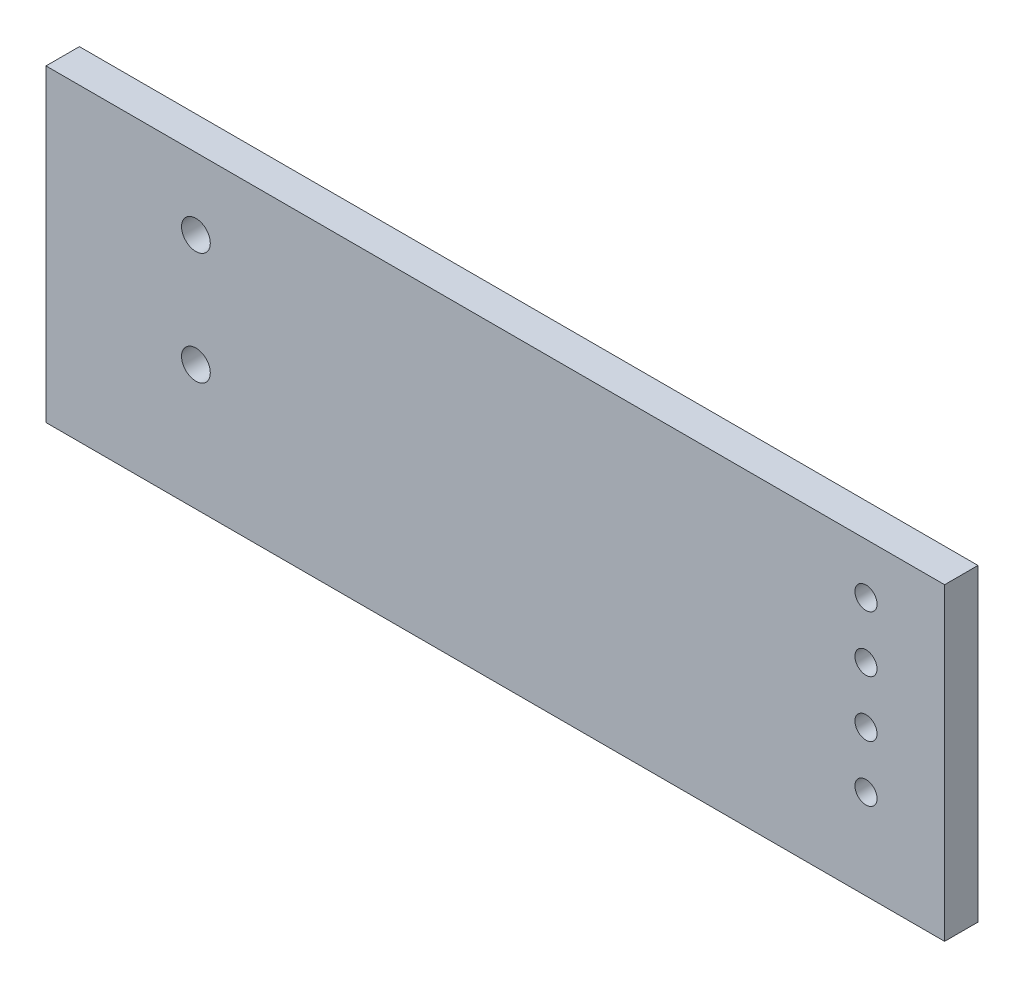
ISO-10303-21;
HEADER;
FILE_DESCRIPTION(('STEP AP214'),'2;1');
FILE_NAME('part.step','',(''),(''),'','','');
FILE_SCHEMA(('AUTOMOTIVE_DESIGN { 1 0 10303 214 1 1 1 1 }'));
ENDSEC;
DATA;
#1=APPLICATION_CONTEXT('core data for automotive mechanical design processes');
#2=APPLICATION_PROTOCOL_DEFINITION('international standard','automotive_design',2000,#1);
#3=PRODUCT_CONTEXT('',#1,'mechanical');
#4=PRODUCT('Part','Part','',(#3));
#5=PRODUCT_RELATED_PRODUCT_CATEGORY('part','',(#4));
#6=PRODUCT_DEFINITION_FORMATION('','',#4);
#7=PRODUCT_DEFINITION_CONTEXT('part definition',#1,'design');
#8=PRODUCT_DEFINITION('design','',#6,#7);
#9=PRODUCT_DEFINITION_SHAPE('','',#8);
#10=(LENGTH_UNIT() NAMED_UNIT(*) SI_UNIT(.MILLI.,.METRE.));
#11=(NAMED_UNIT(*) PLANE_ANGLE_UNIT() SI_UNIT($,.RADIAN.));
#12=(NAMED_UNIT(*) SI_UNIT($,.STERADIAN.) SOLID_ANGLE_UNIT());
#13=UNCERTAINTY_MEASURE_WITH_UNIT(LENGTH_MEASURE(1.E-05),#10,'distance_accuracy_value','');
#14=(GEOMETRIC_REPRESENTATION_CONTEXT(3) GLOBAL_UNCERTAINTY_ASSIGNED_CONTEXT((#13)) GLOBAL_UNIT_ASSIGNED_CONTEXT((#10,
#11,#12)) REPRESENTATION_CONTEXT('',''));
#15=CARTESIAN_POINT('',(0.,0.,0.));
#16=DIRECTION('',(0.,0.,1.));
#17=DIRECTION('',(1.,0.,0.));
#18=AXIS2_PLACEMENT_3D('',#15,#16,#17);
#19=CARTESIAN_POINT('',(82.804,-67.056,-0.046));
#20=DIRECTION('',(0.,0.,-1.));
#21=DIRECTION('',(0.,-1.,0.));
#22=AXIS2_PLACEMENT_3D('',#19,#20,#21);
#23=CYLINDRICAL_SURFACE('',#22,0.5);
#24=CARTESIAN_POINT('',(82.804,-67.056,0.));
#25=DIRECTION('',(0.,0.,-1.));
#26=DIRECTION('',(0.,-1.,0.));
#27=AXIS2_PLACEMENT_3D('',#24,#25,#26);
#28=CIRCLE('',#27,0.5);
#29=CARTESIAN_POINT('',(82.804,-67.556,0.));
#30=VERTEX_POINT('',#29);
#31=EDGE_CURVE('E155',#30,#30,#28,.T.);
#32=ORIENTED_EDGE('',*,*,#31,.T.);
#33=DIRECTION('',(0.,0.,1.));
#34=VECTOR('',#33,1.);
#35=CARTESIAN_POINT('',(82.804,-67.556,-0.046));
#36=LINE('',#35,#34);
#37=CARTESIAN_POINT('',(82.804,-67.556,1.51));
#38=VERTEX_POINT('',#37);
#39=EDGE_CURVE('E11',#30,#38,#36,.T.);
#40=ORIENTED_EDGE('',*,*,#39,.T.);
#41=CARTESIAN_POINT('',(82.804,-67.056,1.51));
#42=DIRECTION('',(0.,0.,-1.));
#43=DIRECTION('',(0.,-1.,0.));
#44=AXIS2_PLACEMENT_3D('',#41,#42,#43);
#45=CIRCLE('',#44,0.5);
#46=EDGE_CURVE('E133',#38,#38,#45,.T.);
#47=ORIENTED_EDGE('',*,*,#46,.F.);
#48=ORIENTED_EDGE('',*,*,#39,.F.);
#49=EDGE_LOOP('',(#32,#40,#47,#48));
#50=FACE_BOUND('',#49,.T.);
#51=ADVANCED_FACE('F17',(#50),#23,.F.);
#52=CARTESIAN_POINT('',(82.804,-69.596,-0.046));
#53=DIRECTION('',(0.,0.,-1.));
#54=DIRECTION('',(0.,-1.,0.));
#55=AXIS2_PLACEMENT_3D('',#52,#53,#54);
#56=CYLINDRICAL_SURFACE('',#55,0.5);
#57=CARTESIAN_POINT('',(82.804,-69.596,0.));
#58=DIRECTION('',(0.,0.,-1.));
#59=DIRECTION('',(0.,-1.,0.));
#60=AXIS2_PLACEMENT_3D('',#57,#58,#59);
#61=CIRCLE('',#60,0.5);
#62=CARTESIAN_POINT('',(82.804,-70.096,0.));
#63=VERTEX_POINT('',#62);
#64=EDGE_CURVE('E118',#63,#63,#61,.T.);
#65=ORIENTED_EDGE('',*,*,#64,.T.);
#66=DIRECTION('',(0.,0.,1.));
#67=VECTOR('',#66,1.);
#68=CARTESIAN_POINT('',(82.804,-70.096,-0.046));
#69=LINE('',#68,#67);
#70=CARTESIAN_POINT('',(82.804,-70.096,1.51));
#71=VERTEX_POINT('',#70);
#72=EDGE_CURVE('E26',#63,#71,#69,.T.);
#73=ORIENTED_EDGE('',*,*,#72,.T.);
#74=CARTESIAN_POINT('',(82.804,-69.596,1.51));
#75=DIRECTION('',(0.,0.,-1.));
#76=DIRECTION('',(0.,-1.,0.));
#77=AXIS2_PLACEMENT_3D('',#74,#75,#76);
#78=CIRCLE('',#77,0.5);
#79=EDGE_CURVE('E119',#71,#71,#78,.T.);
#80=ORIENTED_EDGE('',*,*,#79,.F.);
#81=ORIENTED_EDGE('',*,*,#72,.F.);
#82=EDGE_LOOP('',(#65,#73,#80,#81));
#83=FACE_BOUND('',#82,.T.);
#84=ADVANCED_FACE('F19',(#83),#56,.F.);
#85=CARTESIAN_POINT('',(52.5,-68.,-0.046));
#86=DIRECTION('',(0.,0.,-1.));
#87=DIRECTION('',(0.,-1.,0.));
#88=AXIS2_PLACEMENT_3D('',#85,#86,#87);
#89=CYLINDRICAL_SURFACE('',#88,0.65);
#90=CARTESIAN_POINT('',(52.5,-68.,0.));
#91=DIRECTION('',(0.,0.,-1.));
#92=DIRECTION('',(0.,-1.,0.));
#93=AXIS2_PLACEMENT_3D('',#90,#91,#92);
#94=CIRCLE('',#93,0.65);
#95=CARTESIAN_POINT('',(52.5,-68.65,0.));
#96=VERTEX_POINT('',#95);
#97=EDGE_CURVE('E160',#96,#96,#94,.T.);
#98=ORIENTED_EDGE('',*,*,#97,.T.);
#99=DIRECTION('',(0.,0.,1.));
#100=VECTOR('',#99,1.);
#101=CARTESIAN_POINT('',(52.5,-68.65,-0.046));
#102=LINE('',#101,#100);
#103=CARTESIAN_POINT('',(52.5,-68.65,1.51));
#104=VERTEX_POINT('',#103);
#105=EDGE_CURVE('E121',#96,#104,#102,.T.);
#106=ORIENTED_EDGE('',*,*,#105,.T.);
#107=CARTESIAN_POINT('',(52.5,-68.,1.51));
#108=DIRECTION('',(0.,0.,-1.));
#109=DIRECTION('',(0.,-1.,0.));
#110=AXIS2_PLACEMENT_3D('',#107,#108,#109);
#111=CIRCLE('',#110,0.65);
#112=EDGE_CURVE('E136',#104,#104,#111,.T.);
#113=ORIENTED_EDGE('',*,*,#112,.F.);
#114=ORIENTED_EDGE('',*,*,#105,.F.);
#115=EDGE_LOOP('',(#98,#106,#113,#114));
#116=FACE_BOUND('',#115,.T.);
#117=ADVANCED_FACE('F259',(#116),#89,.F.);
#118=CARTESIAN_POINT('',(82.804,-72.136,-0.046));
#119=DIRECTION('',(0.,0.,-1.));
#120=DIRECTION('',(0.,-1.,0.));
#121=AXIS2_PLACEMENT_3D('',#118,#119,#120);
#122=CYLINDRICAL_SURFACE('',#121,0.5);
#123=CARTESIAN_POINT('',(82.804,-72.136,0.));
#124=DIRECTION('',(0.,0.,-1.));
#125=DIRECTION('',(0.,-1.,0.));
#126=AXIS2_PLACEMENT_3D('',#123,#124,#125);
#127=CIRCLE('',#126,0.5);
#128=CARTESIAN_POINT('',(82.804,-72.636,0.));
#129=VERTEX_POINT('',#128);
#130=EDGE_CURVE('E161',#129,#129,#127,.T.);
#131=ORIENTED_EDGE('',*,*,#130,.T.);
#132=DIRECTION('',(0.,0.,1.));
#133=VECTOR('',#132,1.);
#134=CARTESIAN_POINT('',(82.804,-72.636,-0.046));
#135=LINE('',#134,#133);
#136=CARTESIAN_POINT('',(82.804,-72.636,1.51));
#137=VERTEX_POINT('',#136);
#138=EDGE_CURVE('E124',#129,#137,#135,.T.);
#139=ORIENTED_EDGE('',*,*,#138,.T.);
#140=CARTESIAN_POINT('',(82.804,-72.136,1.51));
#141=DIRECTION('',(0.,0.,-1.));
#142=DIRECTION('',(0.,-1.,0.));
#143=AXIS2_PLACEMENT_3D('',#140,#141,#142);
#144=CIRCLE('',#143,0.5);
#145=EDGE_CURVE('E140',#137,#137,#144,.T.);
#146=ORIENTED_EDGE('',*,*,#145,.F.);
#147=ORIENTED_EDGE('',*,*,#138,.F.);
#148=EDGE_LOOP('',(#131,#139,#146,#147));
#149=FACE_BOUND('',#148,.T.);
#150=ADVANCED_FACE('F317',(#149),#122,.F.);
#151=CARTESIAN_POINT('',(82.804,-74.676,-0.046));
#152=DIRECTION('',(0.,0.,-1.));
#153=DIRECTION('',(0.,-1.,0.));
#154=AXIS2_PLACEMENT_3D('',#151,#152,#153);
#155=CYLINDRICAL_SURFACE('',#154,0.5);
#156=CARTESIAN_POINT('',(82.804,-74.676,0.));
#157=DIRECTION('',(0.,0.,-1.));
#158=DIRECTION('',(0.,-1.,0.));
#159=AXIS2_PLACEMENT_3D('',#156,#157,#158);
#160=CIRCLE('',#159,0.5);
#161=CARTESIAN_POINT('',(82.804,-75.176,0.));
#162=VERTEX_POINT('',#161);
#163=EDGE_CURVE('E165',#162,#162,#160,.T.);
#164=ORIENTED_EDGE('',*,*,#163,.T.);
#165=DIRECTION('',(0.,0.,1.));
#166=VECTOR('',#165,1.);
#167=CARTESIAN_POINT('',(82.804,-75.176,-0.046));
#168=LINE('',#167,#166);
#169=CARTESIAN_POINT('',(82.804,-75.176,1.51));
#170=VERTEX_POINT('',#169);
#171=EDGE_CURVE('E127',#162,#170,#168,.T.);
#172=ORIENTED_EDGE('',*,*,#171,.T.);
#173=CARTESIAN_POINT('',(82.804,-74.676,1.51));
#174=DIRECTION('',(0.,0.,-1.));
#175=DIRECTION('',(0.,-1.,0.));
#176=AXIS2_PLACEMENT_3D('',#173,#174,#175);
#177=CIRCLE('',#176,0.5);
#178=EDGE_CURVE('E144',#170,#170,#177,.T.);
#179=ORIENTED_EDGE('',*,*,#178,.F.);
#180=ORIENTED_EDGE('',*,*,#171,.F.);
#181=EDGE_LOOP('',(#164,#172,#179,#180));
#182=FACE_BOUND('',#181,.T.);
#183=ADVANCED_FACE('F251',(#182),#155,.F.);
#184=CARTESIAN_POINT('',(52.5,-73.08,-0.046));
#185=DIRECTION('',(0.,0.,-1.));
#186=DIRECTION('',(0.,-1.,0.));
#187=AXIS2_PLACEMENT_3D('',#184,#185,#186);
#188=CYLINDRICAL_SURFACE('',#187,0.65);
#189=CARTESIAN_POINT('',(52.5,-73.08,0.));
#190=DIRECTION('',(0.,0.,-1.));
#191=DIRECTION('',(0.,-1.,0.));
#192=AXIS2_PLACEMENT_3D('',#189,#190,#191);
#193=CIRCLE('',#192,0.65);
#194=CARTESIAN_POINT('',(52.5,-73.73,0.));
#195=VERTEX_POINT('',#194);
#196=EDGE_CURVE('E171',#195,#195,#193,.T.);
#197=ORIENTED_EDGE('',*,*,#196,.T.);
#198=DIRECTION('',(0.,0.,1.));
#199=VECTOR('',#198,1.);
#200=CARTESIAN_POINT('',(52.5,-73.73,-0.046));
#201=LINE('',#200,#199);
#202=CARTESIAN_POINT('',(52.5,-73.73,1.51));
#203=VERTEX_POINT('',#202);
#204=EDGE_CURVE('E130',#195,#203,#201,.T.);
#205=ORIENTED_EDGE('',*,*,#204,.T.);
#206=CARTESIAN_POINT('',(52.5,-73.08,1.51));
#207=DIRECTION('',(0.,0.,-1.));
#208=DIRECTION('',(0.,-1.,0.));
#209=AXIS2_PLACEMENT_3D('',#206,#207,#208);
#210=CIRCLE('',#209,0.65);
#211=EDGE_CURVE('E148',#203,#203,#210,.T.);
#212=ORIENTED_EDGE('',*,*,#211,.F.);
#213=ORIENTED_EDGE('',*,*,#204,.F.);
#214=EDGE_LOOP('',(#197,#205,#212,#213));
#215=FACE_BOUND('',#214,.T.);
#216=ADVANCED_FACE('F242',(#215),#188,.F.);
#217=CARTESIAN_POINT('',(45.72,-64.77,0.));
#218=DIRECTION('',(0.,1.,0.));
#219=DIRECTION('',(1.,0.,0.));
#220=AXIS2_PLACEMENT_3D('',#217,#218,#219);
#221=PLANE('',#220);
#222=DIRECTION('',(0.,0.,1.));
#223=VECTOR('',#222,1.);
#224=CARTESIAN_POINT('',(45.72,-64.77,0.));
#225=LINE('',#224,#223);
#226=CARTESIAN_POINT('',(45.72,-64.77,0.));
#227=VERTEX_POINT('',#226);
#228=CARTESIAN_POINT('',(45.72,-64.77,1.51));
#229=VERTEX_POINT('',#228);
#230=EDGE_CURVE('E178',#227,#229,#225,.T.);
#231=ORIENTED_EDGE('',*,*,#230,.T.);
#232=DIRECTION('',(1.,0.,0.));
#233=VECTOR('',#232,1.);
#234=CARTESIAN_POINT('',(45.72,-64.77,1.51));
#235=LINE('',#234,#233);
#236=CARTESIAN_POINT('',(86.36,-64.77,1.51));
#237=VERTEX_POINT('',#236);
#238=EDGE_CURVE('E152',#229,#237,#235,.T.);
#239=ORIENTED_EDGE('',*,*,#238,.T.);
#240=DIRECTION('',(0.,0.,1.));
#241=VECTOR('',#240,1.);
#242=CARTESIAN_POINT('',(86.36,-64.77,0.));
#243=LINE('',#242,#241);
#244=CARTESIAN_POINT('',(86.36,-64.77,0.));
#245=VERTEX_POINT('',#244);
#246=EDGE_CURVE('E194',#245,#237,#243,.T.);
#247=ORIENTED_EDGE('',*,*,#246,.F.);
#248=DIRECTION('',(1.,0.,0.));
#249=VECTOR('',#248,1.);
#250=CARTESIAN_POINT('',(45.72,-64.77,0.));
#251=LINE('',#250,#249);
#252=EDGE_CURVE('E177',#227,#245,#251,.T.);
#253=ORIENTED_EDGE('',*,*,#252,.F.);
#254=EDGE_LOOP('',(#231,#239,#247,#253));
#255=FACE_BOUND('',#254,.T.);
#256=ADVANCED_FACE('F240',(#255),#221,.T.);
#257=CARTESIAN_POINT('',(0.,0.,1.51));
#258=DIRECTION('',(0.,0.,1.));
#259=DIRECTION('',(1.,0.,0.));
#260=AXIS2_PLACEMENT_3D('',#257,#258,#259);
#261=PLANE('',#260);
#262=ORIENTED_EDGE('',*,*,#46,.T.);
#263=EDGE_LOOP('',(#262));
#264=FACE_BOUND('',#263,.T.);
#265=ORIENTED_EDGE('',*,*,#79,.T.);
#266=EDGE_LOOP('',(#265));
#267=FACE_BOUND('',#266,.T.);
#268=ORIENTED_EDGE('',*,*,#112,.T.);
#269=EDGE_LOOP('',(#268));
#270=FACE_BOUND('',#269,.T.);
#271=ORIENTED_EDGE('',*,*,#145,.T.);
#272=EDGE_LOOP('',(#271));
#273=FACE_BOUND('',#272,.T.);
#274=ORIENTED_EDGE('',*,*,#178,.T.);
#275=EDGE_LOOP('',(#274));
#276=FACE_BOUND('',#275,.T.);
#277=ORIENTED_EDGE('',*,*,#211,.T.);
#278=EDGE_LOOP('',(#277));
#279=FACE_BOUND('',#278,.T.);
#280=DIRECTION('',(-1.,0.,0.));
#281=VECTOR('',#280,1.);
#282=CARTESIAN_POINT('',(86.36,-78.74,1.51));
#283=LINE('',#282,#281);
#284=CARTESIAN_POINT('',(86.36,-78.74,1.51));
#285=VERTEX_POINT('',#284);
#286=CARTESIAN_POINT('',(45.72,-78.74,1.51));
#287=VERTEX_POINT('',#286);
#288=EDGE_CURVE('E206',#285,#287,#283,.T.);
#289=ORIENTED_EDGE('',*,*,#288,.F.);
#290=DIRECTION('',(0.,-1.,0.));
#291=VECTOR('',#290,1.);
#292=CARTESIAN_POINT('',(86.36,-64.77,1.51));
#293=LINE('',#292,#291);
#294=EDGE_CURVE('E191',#237,#285,#293,.T.);
#295=ORIENTED_EDGE('',*,*,#294,.F.);
#296=ORIENTED_EDGE('',*,*,#238,.F.);
#297=DIRECTION('',(0.,1.,0.));
#298=VECTOR('',#297,1.);
#299=CARTESIAN_POINT('',(45.72,-78.74,1.51));
#300=LINE('',#299,#298);
#301=EDGE_CURVE('E183',#287,#229,#300,.T.);
#302=ORIENTED_EDGE('',*,*,#301,.F.);
#303=EDGE_LOOP('',(#289,#295,#296,#302));
#304=FACE_BOUND('',#303,.T.);
#305=ADVANCED_FACE('F235',(#264,#267,#270,#273,#276,#279,#304),#261,.T.);
#306=CARTESIAN_POINT('',(0.,0.,0.));
#307=DIRECTION('',(0.,0.,1.));
#308=DIRECTION('',(1.,0.,0.));
#309=AXIS2_PLACEMENT_3D('',#306,#307,#308);
#310=PLANE('',#309);
#311=ORIENTED_EDGE('',*,*,#31,.F.);
#312=EDGE_LOOP('',(#311));
#313=FACE_BOUND('',#312,.T.);
#314=ORIENTED_EDGE('',*,*,#64,.F.);
#315=EDGE_LOOP('',(#314));
#316=FACE_BOUND('',#315,.T.);
#317=ORIENTED_EDGE('',*,*,#97,.F.);
#318=EDGE_LOOP('',(#317));
#319=FACE_BOUND('',#318,.T.);
#320=ORIENTED_EDGE('',*,*,#130,.F.);
#321=EDGE_LOOP('',(#320));
#322=FACE_BOUND('',#321,.T.);
#323=ORIENTED_EDGE('',*,*,#163,.F.);
#324=EDGE_LOOP('',(#323));
#325=FACE_BOUND('',#324,.T.);
#326=ORIENTED_EDGE('',*,*,#196,.F.);
#327=EDGE_LOOP('',(#326));
#328=FACE_BOUND('',#327,.T.);
#329=DIRECTION('',(0.,1.,0.));
#330=VECTOR('',#329,1.);
#331=CARTESIAN_POINT('',(45.72,-78.74,0.));
#332=LINE('',#331,#330);
#333=CARTESIAN_POINT('',(45.72,-78.74,0.));
#334=VERTEX_POINT('',#333);
#335=EDGE_CURVE('E182',#334,#227,#332,.T.);
#336=ORIENTED_EDGE('',*,*,#335,.T.);
#337=ORIENTED_EDGE('',*,*,#252,.T.);
#338=DIRECTION('',(0.,-1.,0.));
#339=VECTOR('',#338,1.);
#340=CARTESIAN_POINT('',(86.36,-64.77,0.));
#341=LINE('',#340,#339);
#342=CARTESIAN_POINT('',(86.36,-78.74,0.));
#343=VERTEX_POINT('',#342);
#344=EDGE_CURVE('E187',#245,#343,#341,.T.);
#345=ORIENTED_EDGE('',*,*,#344,.T.);
#346=DIRECTION('',(-1.,0.,0.));
#347=VECTOR('',#346,1.);
#348=CARTESIAN_POINT('',(86.36,-78.74,0.));
#349=LINE('',#348,#347);
#350=EDGE_CURVE('E198',#343,#334,#349,.T.);
#351=ORIENTED_EDGE('',*,*,#350,.T.);
#352=EDGE_LOOP('',(#336,#337,#345,#351));
#353=FACE_BOUND('',#352,.T.);
#354=ADVANCED_FACE('F224',(#313,#316,#319,#322,#325,#328,#353),#310,.F.);
#355=CARTESIAN_POINT('',(45.72,-78.74,0.));
#356=DIRECTION('',(-1.,0.,0.));
#357=DIRECTION('',(0.,0.,1.));
#358=AXIS2_PLACEMENT_3D('',#355,#356,#357);
#359=PLANE('',#358);
#360=DIRECTION('',(0.,0.,1.));
#361=VECTOR('',#360,1.);
#362=CARTESIAN_POINT('',(45.72,-78.74,0.));
#363=LINE('',#362,#361);
#364=EDGE_CURVE('E202',#334,#287,#363,.T.);
#365=ORIENTED_EDGE('',*,*,#364,.T.);
#366=ORIENTED_EDGE('',*,*,#301,.T.);
#367=ORIENTED_EDGE('',*,*,#230,.F.);
#368=ORIENTED_EDGE('',*,*,#335,.F.);
#369=EDGE_LOOP('',(#365,#366,#367,#368));
#370=FACE_BOUND('',#369,.T.);
#371=ADVANCED_FACE('F238',(#370),#359,.T.);
#372=CARTESIAN_POINT('',(86.36,-64.77,0.));
#373=DIRECTION('',(1.,0.,0.));
#374=DIRECTION('',(0.,1.,0.));
#375=AXIS2_PLACEMENT_3D('',#372,#373,#374);
#376=PLANE('',#375);
#377=ORIENTED_EDGE('',*,*,#246,.T.);
#378=ORIENTED_EDGE('',*,*,#294,.T.);
#379=DIRECTION('',(0.,0.,1.));
#380=VECTOR('',#379,1.);
#381=CARTESIAN_POINT('',(86.36,-78.74,0.));
#382=LINE('',#381,#380);
#383=EDGE_CURVE('E212',#343,#285,#382,.T.);
#384=ORIENTED_EDGE('',*,*,#383,.F.);
#385=ORIENTED_EDGE('',*,*,#344,.F.);
#386=EDGE_LOOP('',(#377,#378,#384,#385));
#387=FACE_BOUND('',#386,.T.);
#388=ADVANCED_FACE('F231',(#387),#376,.T.);
#389=CARTESIAN_POINT('',(86.36,-78.74,0.));
#390=DIRECTION('',(0.,-1.,0.));
#391=DIRECTION('',(0.,0.,-1.));
#392=AXIS2_PLACEMENT_3D('',#389,#390,#391);
#393=PLANE('',#392);
#394=ORIENTED_EDGE('',*,*,#383,.T.);
#395=ORIENTED_EDGE('',*,*,#288,.T.);
#396=ORIENTED_EDGE('',*,*,#364,.F.);
#397=ORIENTED_EDGE('',*,*,#350,.F.);
#398=EDGE_LOOP('',(#394,#395,#396,#397));
#399=FACE_BOUND('',#398,.T.);
#400=ADVANCED_FACE('F230',(#399),#393,.T.);
#401=CLOSED_SHELL('',(#51,#84,#117,#150,#183,#216,#256,#305,#354,#371,#388,#400));
#402=MANIFOLD_SOLID_BREP('B1',#401);
#403=ADVANCED_BREP_SHAPE_REPRESENTATION('',(#18,#402),#14);
#404=SHAPE_DEFINITION_REPRESENTATION(#9,#403);
ENDSEC;
END-ISO-10303-21;
